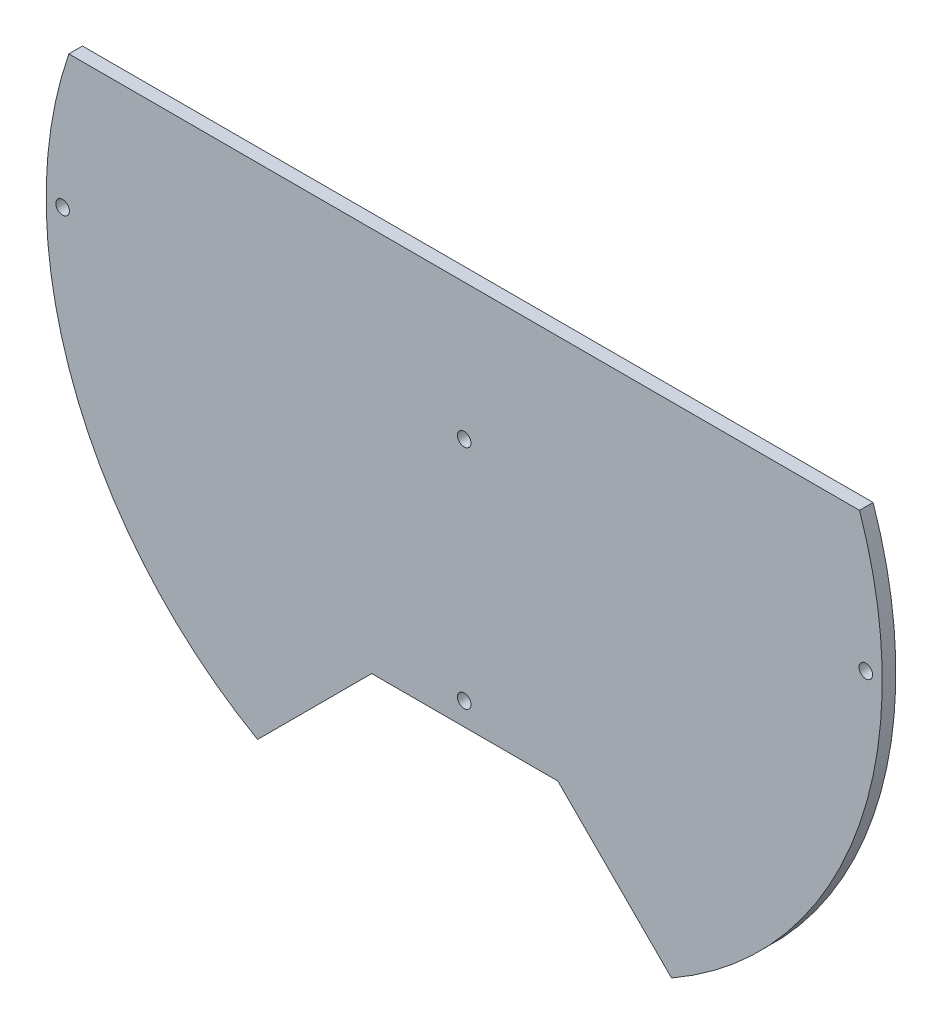
ISO-10303-21;
HEADER;
FILE_DESCRIPTION(('STEP AP214'),'2;1');
FILE_NAME('part.step','',(''),(''),'','','');
FILE_SCHEMA(('AUTOMOTIVE_DESIGN { 1 0 10303 214 1 1 1 1 }'));
ENDSEC;
DATA;
#1=APPLICATION_CONTEXT('core data for automotive mechanical design processes');
#2=APPLICATION_PROTOCOL_DEFINITION('international standard','automotive_design',2000,#1);
#3=PRODUCT_CONTEXT('',#1,'mechanical');
#4=PRODUCT('Part','Part','',(#3));
#5=PRODUCT_RELATED_PRODUCT_CATEGORY('part','',(#4));
#6=PRODUCT_DEFINITION_FORMATION('','',#4);
#7=PRODUCT_DEFINITION_CONTEXT('part definition',#1,'design');
#8=PRODUCT_DEFINITION('design','',#6,#7);
#9=PRODUCT_DEFINITION_SHAPE('','',#8);
#10=(LENGTH_UNIT() NAMED_UNIT(*) SI_UNIT(.MILLI.,.METRE.));
#11=(NAMED_UNIT(*) PLANE_ANGLE_UNIT() SI_UNIT($,.RADIAN.));
#12=(NAMED_UNIT(*) SI_UNIT($,.STERADIAN.) SOLID_ANGLE_UNIT());
#13=UNCERTAINTY_MEASURE_WITH_UNIT(LENGTH_MEASURE(1.E-05),#10,'distance_accuracy_value','');
#14=(GEOMETRIC_REPRESENTATION_CONTEXT(3) GLOBAL_UNCERTAINTY_ASSIGNED_CONTEXT((#13)) GLOBAL_UNIT_ASSIGNED_CONTEXT((#10,
#11,#12)) REPRESENTATION_CONTEXT('',''));
#15=CARTESIAN_POINT('',(0.,0.,0.));
#16=DIRECTION('',(0.,0.,1.));
#17=DIRECTION('',(1.,0.,0.));
#18=AXIS2_PLACEMENT_3D('',#15,#16,#17);
#19=CARTESIAN_POINT('',(0.,25.0907418036299,3.));
#20=DIRECTION('',(0.,0.,1.));
#21=DIRECTION('',(1.,0.,0.));
#22=AXIS2_PLACEMENT_3D('',#19,#20,#21);
#23=PLANE('',#22);
#24=CARTESIAN_POINT('',(0.,25.0907418036299,3.));
#25=DIRECTION('',(0.,0.,1.));
#26=DIRECTION('',(1.,0.,0.));
#27=AXIS2_PLACEMENT_3D('',#24,#25,#26);
#28=CIRCLE('',#27,1.49999999999636);
#29=CARTESIAN_POINT('',(1.49999999999637,25.0907418036299,3.));
#30=VERTEX_POINT('',#29);
#31=EDGE_CURVE('E201',#30,#30,#28,.T.);
#32=ORIENTED_EDGE('',*,*,#31,.F.);
#33=EDGE_LOOP('',(#32));
#34=FACE_BOUND('',#33,.T.);
#35=CARTESIAN_POINT('',(-3.62210261783957E-12,-24.9092581963706,3.));
#36=DIRECTION('',(0.,0.,1.));
#37=DIRECTION('',(1.,0.,0.));
#38=AXIS2_PLACEMENT_3D('',#35,#36,#37);
#39=CIRCLE('',#38,1.5);
#40=CARTESIAN_POINT('',(1.49999999999638,-24.9092581963706,3.));
#41=VERTEX_POINT('',#40);
#42=EDGE_CURVE('E134',#41,#41,#39,.T.);
#43=ORIENTED_EDGE('',*,*,#42,.F.);
#44=EDGE_LOOP('',(#43));
#45=FACE_BOUND('',#44,.T.);
#46=CARTESIAN_POINT('',(0.,25.0907418036299,3.));
#47=DIRECTION('',(0.,0.,1.));
#48=DIRECTION('',(1.,0.,0.));
#49=AXIS2_PLACEMENT_3D('',#46,#47,#48);
#50=CIRCLE('',#49,92.233996255391);
#51=CARTESIAN_POINT('',(-87.2187483585925,55.0907418036299,3.));
#52=VERTEX_POINT('',#51);
#53=CARTESIAN_POINT('',(-45.5855212954531,-55.0907418036299,3.));
#54=VERTEX_POINT('',#53);
#55=EDGE_CURVE('E141',#52,#54,#50,.T.);
#56=ORIENTED_EDGE('',*,*,#55,.T.);
#57=DIRECTION('',(0.707106781186544,0.707106781186551,0.));
#58=VECTOR('',#57,1.);
#59=CARTESIAN_POINT('',(-20.4040376881935,-29.9092581963701,3.));
#60=LINE('',#59,#58);
#61=CARTESIAN_POINT('',(-20.4040376881935,-29.9092581963701,3.));
#62=VERTEX_POINT('',#61);
#63=EDGE_CURVE('E99',#54,#62,#60,.T.);
#64=ORIENTED_EDGE('',*,*,#63,.T.);
#65=DIRECTION('',(1.,0.,0.));
#66=VECTOR('',#65,1.);
#67=CARTESIAN_POINT('',(-20.4040376881935,-29.9092581963701,3.));
#68=LINE('',#67,#66);
#69=CARTESIAN_POINT('',(20.6488315442086,-29.9092581963701,3.));
#70=VERTEX_POINT('',#69);
#71=EDGE_CURVE('E112',#62,#70,#68,.T.);
#72=ORIENTED_EDGE('',*,*,#71,.T.);
#73=DIRECTION('',(0.707106781186542,-0.707106781186553,0.));
#74=VECTOR('',#73,1.);
#75=CARTESIAN_POINT('',(20.6488315442086,-29.9092581963701,3.));
#76=LINE('',#75,#74);
#77=CARTESIAN_POINT('',(45.7414590835169,-55.0018857356788,3.));
#78=VERTEX_POINT('',#77);
#79=EDGE_CURVE('E106',#70,#78,#76,.T.);
#80=ORIENTED_EDGE('',*,*,#79,.T.);
#81=CARTESIAN_POINT('',(0.,25.0907418036299,3.));
#82=DIRECTION('',(0.,0.,1.));
#83=DIRECTION('',(1.,0.,0.));
#84=AXIS2_PLACEMENT_3D('',#81,#82,#83);
#85=CIRCLE('',#84,92.233996255391);
#86=CARTESIAN_POINT('',(87.2187483585925,55.0907418036299,3.));
#87=VERTEX_POINT('',#86);
#88=EDGE_CURVE('E110',#78,#87,#85,.T.);
#89=ORIENTED_EDGE('',*,*,#88,.T.);
#90=DIRECTION('',(-1.,0.,0.));
#91=VECTOR('',#90,1.);
#92=CARTESIAN_POINT('',(87.2187483585925,55.0907418036299,3.));
#93=LINE('',#92,#91);
#94=EDGE_CURVE('E62',#87,#52,#93,.T.);
#95=ORIENTED_EDGE('',*,*,#94,.T.);
#96=EDGE_LOOP('',(#56,#64,#72,#80,#89,#95));
#97=FACE_BOUND('',#96,.T.);
#98=CARTESIAN_POINT('',(88.6057449647125,25.0907418036294,3.));
#99=DIRECTION('',(0.,0.,1.));
#100=DIRECTION('',(1.,0.,0.));
#101=AXIS2_PLACEMENT_3D('',#98,#99,#100);
#102=CIRCLE('',#101,1.5);
#103=CARTESIAN_POINT('',(90.1057449647125,25.0907418036294,3.));
#104=VERTEX_POINT('',#103);
#105=EDGE_CURVE('E207',#104,#104,#102,.T.);
#106=ORIENTED_EDGE('',*,*,#105,.F.);
#107=EDGE_LOOP('',(#106));
#108=FACE_BOUND('',#107,.T.);
#109=CARTESIAN_POINT('',(-88.6057449647198,25.0907418036294,3.));
#110=DIRECTION('',(0.,0.,1.));
#111=DIRECTION('',(1.,0.,0.));
#112=AXIS2_PLACEMENT_3D('',#109,#110,#111);
#113=CIRCLE('',#112,1.5);
#114=CARTESIAN_POINT('',(-87.1057449647198,25.0907418036294,3.));
#115=VERTEX_POINT('',#114);
#116=EDGE_CURVE('E192',#115,#115,#113,.T.);
#117=ORIENTED_EDGE('',*,*,#116,.F.);
#118=EDGE_LOOP('',(#117));
#119=FACE_BOUND('',#118,.T.);
#120=ADVANCED_FACE('F45',(#34,#45,#97,#108,#119),#23,.T.);
#121=CARTESIAN_POINT('',(0.,25.0907418036299,0.));
#122=DIRECTION('',(0.,0.,1.));
#123=DIRECTION('',(1.,0.,0.));
#124=AXIS2_PLACEMENT_3D('',#121,#122,#123);
#125=PLANE('',#124);
#126=CARTESIAN_POINT('',(0.,25.0907418036299,0.));
#127=DIRECTION('',(0.,0.,1.));
#128=DIRECTION('',(1.,0.,0.));
#129=AXIS2_PLACEMENT_3D('',#126,#127,#128);
#130=CIRCLE('',#129,92.233996255391);
#131=CARTESIAN_POINT('',(-87.2187483585925,55.0907418036299,0.));
#132=VERTEX_POINT('',#131);
#133=CARTESIAN_POINT('',(-45.5855212954531,-55.0907418036299,0.));
#134=VERTEX_POINT('',#133);
#135=EDGE_CURVE('E130',#132,#134,#130,.T.);
#136=ORIENTED_EDGE('',*,*,#135,.F.);
#137=DIRECTION('',(-1.,0.,0.));
#138=VECTOR('',#137,1.);
#139=CARTESIAN_POINT('',(87.2187483585925,55.0907418036299,0.));
#140=LINE('',#139,#138);
#141=CARTESIAN_POINT('',(87.2187483585925,55.0907418036299,0.));
#142=VERTEX_POINT('',#141);
#143=EDGE_CURVE('E91',#142,#132,#140,.T.);
#144=ORIENTED_EDGE('',*,*,#143,.F.);
#145=CARTESIAN_POINT('',(0.,25.0907418036299,0.));
#146=DIRECTION('',(0.,0.,1.));
#147=DIRECTION('',(1.,0.,0.));
#148=AXIS2_PLACEMENT_3D('',#145,#146,#147);
#149=CIRCLE('',#148,92.233996255391);
#150=CARTESIAN_POINT('',(45.7414590835169,-55.0018857356788,0.));
#151=VERTEX_POINT('',#150);
#152=EDGE_CURVE('E85',#151,#142,#149,.T.);
#153=ORIENTED_EDGE('',*,*,#152,.F.);
#154=DIRECTION('',(0.707106781186542,-0.707106781186553,0.));
#155=VECTOR('',#154,1.);
#156=CARTESIAN_POINT('',(20.6488315442086,-29.9092581963701,0.));
#157=LINE('',#156,#155);
#158=CARTESIAN_POINT('',(20.6488315442086,-29.9092581963701,0.));
#159=VERTEX_POINT('',#158);
#160=EDGE_CURVE('E120',#159,#151,#157,.T.);
#161=ORIENTED_EDGE('',*,*,#160,.F.);
#162=DIRECTION('',(1.,0.,0.));
#163=VECTOR('',#162,1.);
#164=CARTESIAN_POINT('',(-20.4040376881935,-29.9092581963701,0.));
#165=LINE('',#164,#163);
#166=CARTESIAN_POINT('',(-20.4040376881935,-29.9092581963701,0.));
#167=VERTEX_POINT('',#166);
#168=EDGE_CURVE('E136',#167,#159,#165,.T.);
#169=ORIENTED_EDGE('',*,*,#168,.F.);
#170=DIRECTION('',(0.707106781186544,0.707106781186551,0.));
#171=VECTOR('',#170,1.);
#172=CARTESIAN_POINT('',(-20.4040376881935,-29.9092581963701,0.));
#173=LINE('',#172,#171);
#174=EDGE_CURVE('E133',#134,#167,#173,.T.);
#175=ORIENTED_EDGE('',*,*,#174,.F.);
#176=EDGE_LOOP('',(#136,#144,#153,#161,#169,#175));
#177=FACE_BOUND('',#176,.T.);
#178=CARTESIAN_POINT('',(-3.62210261783957E-12,-24.9092581963706,0.));
#179=DIRECTION('',(0.,0.,1.));
#180=DIRECTION('',(1.,0.,0.));
#181=AXIS2_PLACEMENT_3D('',#178,#179,#180);
#182=CIRCLE('',#181,1.5);
#183=CARTESIAN_POINT('',(1.49999999999638,-24.9092581963706,0.));
#184=VERTEX_POINT('',#183);
#185=EDGE_CURVE('E210',#184,#184,#182,.T.);
#186=ORIENTED_EDGE('',*,*,#185,.T.);
#187=EDGE_LOOP('',(#186));
#188=FACE_BOUND('',#187,.T.);
#189=CARTESIAN_POINT('',(88.6057449647125,25.0907418036294,0.));
#190=DIRECTION('',(0.,0.,1.));
#191=DIRECTION('',(1.,0.,0.));
#192=AXIS2_PLACEMENT_3D('',#189,#190,#191);
#193=CIRCLE('',#192,1.5);
#194=CARTESIAN_POINT('',(90.1057449647125,25.0907418036294,0.));
#195=VERTEX_POINT('',#194);
#196=EDGE_CURVE('E204',#195,#195,#193,.T.);
#197=ORIENTED_EDGE('',*,*,#196,.T.);
#198=EDGE_LOOP('',(#197));
#199=FACE_BOUND('',#198,.T.);
#200=CARTESIAN_POINT('',(0.,25.0907418036299,0.));
#201=DIRECTION('',(0.,0.,1.));
#202=DIRECTION('',(1.,0.,0.));
#203=AXIS2_PLACEMENT_3D('',#200,#201,#202);
#204=CIRCLE('',#203,1.49999999999636);
#205=CARTESIAN_POINT('',(1.49999999999637,25.0907418036299,0.));
#206=VERTEX_POINT('',#205);
#207=EDGE_CURVE('E198',#206,#206,#204,.T.);
#208=ORIENTED_EDGE('',*,*,#207,.T.);
#209=EDGE_LOOP('',(#208));
#210=FACE_BOUND('',#209,.T.);
#211=CARTESIAN_POINT('',(-88.6057449647198,25.0907418036294,0.));
#212=DIRECTION('',(0.,0.,1.));
#213=DIRECTION('',(1.,0.,0.));
#214=AXIS2_PLACEMENT_3D('',#211,#212,#213);
#215=CIRCLE('',#214,1.5);
#216=CARTESIAN_POINT('',(-87.1057449647198,25.0907418036294,0.));
#217=VERTEX_POINT('',#216);
#218=EDGE_CURVE('E195',#217,#217,#215,.T.);
#219=ORIENTED_EDGE('',*,*,#218,.T.);
#220=EDGE_LOOP('',(#219));
#221=FACE_BOUND('',#220,.T.);
#222=ADVANCED_FACE('F150',(#177,#188,#199,#210,#221),#125,.F.);
#223=CARTESIAN_POINT('',(0.,25.0907418036299,3.));
#224=DIRECTION('',(0.,0.,-1.));
#225=DIRECTION('',(-1.,0.,0.));
#226=AXIS2_PLACEMENT_3D('',#223,#224,#225);
#227=CYLINDRICAL_SURFACE('',#226,92.233996255391);
#228=ORIENTED_EDGE('',*,*,#135,.T.);
#229=DIRECTION('',(0.,0.,-1.));
#230=VECTOR('',#229,1.);
#231=CARTESIAN_POINT('',(-45.5855212954531,-55.0907418036299,3.));
#232=LINE('',#231,#230);
#233=EDGE_CURVE('E11',#54,#134,#232,.T.);
#234=ORIENTED_EDGE('',*,*,#233,.F.);
#235=ORIENTED_EDGE('',*,*,#55,.F.);
#236=DIRECTION('',(0.,0.,-1.));
#237=VECTOR('',#236,1.);
#238=CARTESIAN_POINT('',(-87.2187483585925,55.0907418036299,3.));
#239=LINE('',#238,#237);
#240=EDGE_CURVE('E126',#52,#132,#239,.T.);
#241=ORIENTED_EDGE('',*,*,#240,.T.);
#242=EDGE_LOOP('',(#228,#234,#235,#241));
#243=FACE_BOUND('',#242,.T.);
#244=ADVANCED_FACE('F47',(#243),#227,.T.);
#245=CARTESIAN_POINT('',(-20.4040376881935,-29.9092581963701,3.));
#246=DIRECTION('',(-0.707106781186551,0.707106781186544,0.));
#247=DIRECTION('',(-0.707106781186544,-0.707106781186551,0.));
#248=AXIS2_PLACEMENT_3D('',#245,#246,#247);
#249=PLANE('',#248);
#250=ORIENTED_EDGE('',*,*,#174,.T.);
#251=DIRECTION('',(0.,0.,-1.));
#252=VECTOR('',#251,1.);
#253=CARTESIAN_POINT('',(-20.4040376881935,-29.9092581963701,3.));
#254=LINE('',#253,#252);
#255=EDGE_CURVE('E54',#62,#167,#254,.T.);
#256=ORIENTED_EDGE('',*,*,#255,.F.);
#257=ORIENTED_EDGE('',*,*,#63,.F.);
#258=ORIENTED_EDGE('',*,*,#233,.T.);
#259=EDGE_LOOP('',(#250,#256,#257,#258));
#260=FACE_BOUND('',#259,.T.);
#261=ADVANCED_FACE('F268',(#260),#249,.F.);
#262=CARTESIAN_POINT('',(-20.4040376881935,-29.9092581963701,3.));
#263=DIRECTION('',(0.,1.,0.));
#264=DIRECTION('',(0.,0.,1.));
#265=AXIS2_PLACEMENT_3D('',#262,#263,#264);
#266=PLANE('',#265);
#267=ORIENTED_EDGE('',*,*,#168,.T.);
#268=DIRECTION('',(0.,0.,-1.));
#269=VECTOR('',#268,1.);
#270=CARTESIAN_POINT('',(20.6488315442086,-29.9092581963701,3.));
#271=LINE('',#270,#269);
#272=EDGE_CURVE('E121',#70,#159,#271,.T.);
#273=ORIENTED_EDGE('',*,*,#272,.F.);
#274=ORIENTED_EDGE('',*,*,#71,.F.);
#275=ORIENTED_EDGE('',*,*,#255,.T.);
#276=EDGE_LOOP('',(#267,#273,#274,#275));
#277=FACE_BOUND('',#276,.T.);
#278=ADVANCED_FACE('F147',(#277),#266,.F.);
#279=CARTESIAN_POINT('',(20.6488315442086,-29.9092581963701,3.));
#280=DIRECTION('',(0.707106781186553,0.707106781186542,0.));
#281=DIRECTION('',(-0.707106781186542,0.707106781186553,0.));
#282=AXIS2_PLACEMENT_3D('',#279,#280,#281);
#283=PLANE('',#282);
#284=ORIENTED_EDGE('',*,*,#160,.T.);
#285=DIRECTION('',(0.,0.,-1.));
#286=VECTOR('',#285,1.);
#287=CARTESIAN_POINT('',(45.7414590835169,-55.0018857356788,3.));
#288=LINE('',#287,#286);
#289=EDGE_CURVE('E117',#78,#151,#288,.T.);
#290=ORIENTED_EDGE('',*,*,#289,.F.);
#291=ORIENTED_EDGE('',*,*,#79,.F.);
#292=ORIENTED_EDGE('',*,*,#272,.T.);
#293=EDGE_LOOP('',(#284,#290,#291,#292));
#294=FACE_BOUND('',#293,.T.);
#295=ADVANCED_FACE('F118',(#294),#283,.F.);
#296=CARTESIAN_POINT('',(0.,25.0907418036299,3.));
#297=DIRECTION('',(0.,0.,-1.));
#298=DIRECTION('',(-1.,0.,0.));
#299=AXIS2_PLACEMENT_3D('',#296,#297,#298);
#300=CYLINDRICAL_SURFACE('',#299,92.233996255391);
#301=ORIENTED_EDGE('',*,*,#152,.T.);
#302=DIRECTION('',(0.,0.,-1.));
#303=VECTOR('',#302,1.);
#304=CARTESIAN_POINT('',(87.2187483585925,55.0907418036299,3.));
#305=LINE('',#304,#303);
#306=EDGE_CURVE('E122',#87,#142,#305,.T.);
#307=ORIENTED_EDGE('',*,*,#306,.F.);
#308=ORIENTED_EDGE('',*,*,#88,.F.);
#309=ORIENTED_EDGE('',*,*,#289,.T.);
#310=EDGE_LOOP('',(#301,#307,#308,#309));
#311=FACE_BOUND('',#310,.T.);
#312=ADVANCED_FACE('F124',(#311),#300,.T.);
#313=CARTESIAN_POINT('',(87.2187483585925,55.0907418036299,3.));
#314=DIRECTION('',(0.,-1.,0.));
#315=DIRECTION('',(0.,0.,-1.));
#316=AXIS2_PLACEMENT_3D('',#313,#314,#315);
#317=PLANE('',#316);
#318=ORIENTED_EDGE('',*,*,#143,.T.);
#319=ORIENTED_EDGE('',*,*,#240,.F.);
#320=ORIENTED_EDGE('',*,*,#94,.F.);
#321=ORIENTED_EDGE('',*,*,#306,.T.);
#322=EDGE_LOOP('',(#318,#319,#320,#321));
#323=FACE_BOUND('',#322,.T.);
#324=ADVANCED_FACE('F155',(#323),#317,.F.);
#325=CARTESIAN_POINT('',(-3.62210261783957E-12,-24.9092581963706,3.));
#326=DIRECTION('',(0.,0.,-1.));
#327=DIRECTION('',(-1.,0.,0.));
#328=AXIS2_PLACEMENT_3D('',#325,#326,#327);
#329=CYLINDRICAL_SURFACE('',#328,1.5);
#330=ORIENTED_EDGE('',*,*,#42,.T.);
#331=EDGE_LOOP('',(#330));
#332=FACE_BOUND('',#331,.T.);
#333=ORIENTED_EDGE('',*,*,#185,.F.);
#334=EDGE_LOOP('',(#333));
#335=FACE_BOUND('',#334,.T.);
#336=ADVANCED_FACE('F157',(#332,#335),#329,.F.);
#337=CARTESIAN_POINT('',(88.6057449647125,25.0907418036294,3.));
#338=DIRECTION('',(0.,0.,-1.));
#339=DIRECTION('',(-1.,0.,0.));
#340=AXIS2_PLACEMENT_3D('',#337,#338,#339);
#341=CYLINDRICAL_SURFACE('',#340,1.5);
#342=ORIENTED_EDGE('',*,*,#105,.T.);
#343=EDGE_LOOP('',(#342));
#344=FACE_BOUND('',#343,.T.);
#345=ORIENTED_EDGE('',*,*,#196,.F.);
#346=EDGE_LOOP('',(#345));
#347=FACE_BOUND('',#346,.T.);
#348=ADVANCED_FACE('F163',(#344,#347),#341,.F.);
#349=CARTESIAN_POINT('',(0.,25.0907418036299,3.));
#350=DIRECTION('',(0.,0.,-1.));
#351=DIRECTION('',(-1.,0.,0.));
#352=AXIS2_PLACEMENT_3D('',#349,#350,#351);
#353=CYLINDRICAL_SURFACE('',#352,1.49999999999636);
#354=ORIENTED_EDGE('',*,*,#31,.T.);
#355=EDGE_LOOP('',(#354));
#356=FACE_BOUND('',#355,.T.);
#357=ORIENTED_EDGE('',*,*,#207,.F.);
#358=EDGE_LOOP('',(#357));
#359=FACE_BOUND('',#358,.T.);
#360=ADVANCED_FACE('F179',(#356,#359),#353,.F.);
#361=CARTESIAN_POINT('',(-88.6057449647198,25.0907418036294,3.));
#362=DIRECTION('',(0.,0.,-1.));
#363=DIRECTION('',(-1.,0.,0.));
#364=AXIS2_PLACEMENT_3D('',#361,#362,#363);
#365=CYLINDRICAL_SURFACE('',#364,1.5);
#366=ORIENTED_EDGE('',*,*,#116,.T.);
#367=EDGE_LOOP('',(#366));
#368=FACE_BOUND('',#367,.T.);
#369=ORIENTED_EDGE('',*,*,#218,.F.);
#370=EDGE_LOOP('',(#369));
#371=FACE_BOUND('',#370,.T.);
#372=ADVANCED_FACE('F183',(#368,#371),#365,.F.);
#373=CLOSED_SHELL('',(#120,#222,#244,#261,#278,#295,#312,#324,#336,#348,#360,#372));
#374=MANIFOLD_SOLID_BREP('B2',#373);
#375=ADVANCED_BREP_SHAPE_REPRESENTATION('',(#18,#374),#14);
#376=SHAPE_DEFINITION_REPRESENTATION(#9,#375);
ENDSEC;
END-ISO-10303-21;
